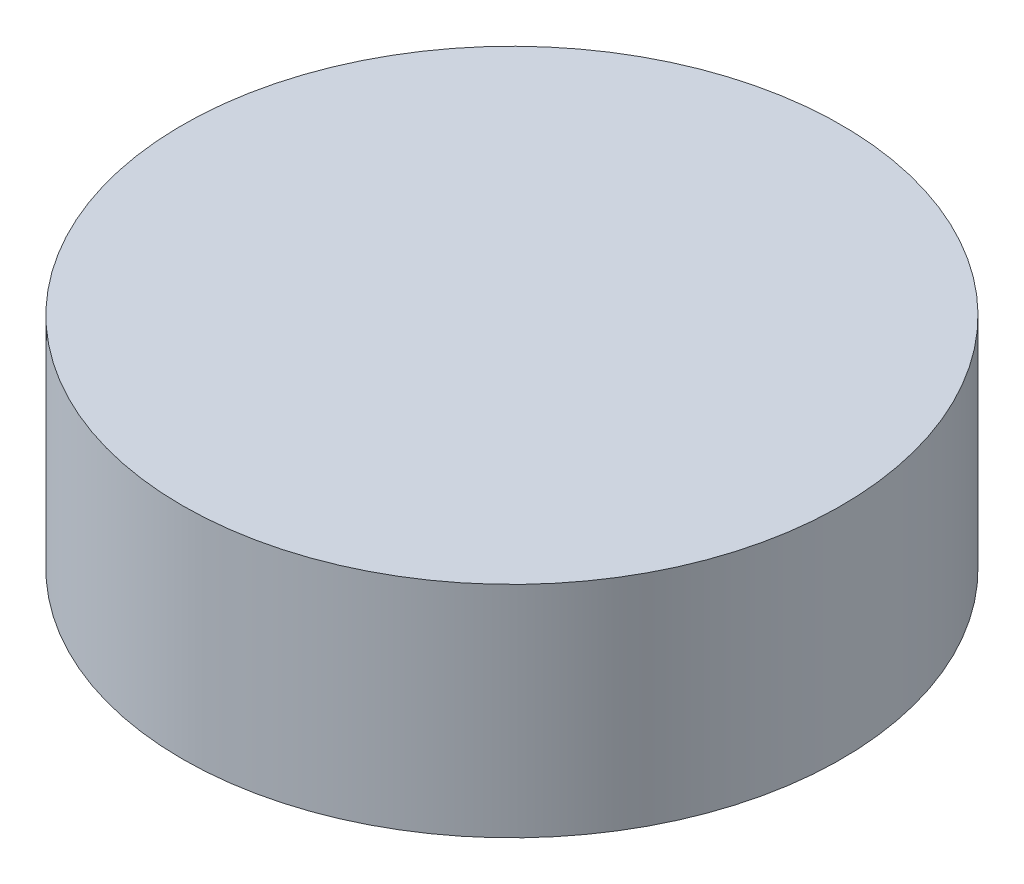
ISO-10303-21;
HEADER;
FILE_DESCRIPTION(('STEP AP214'),'2;1');
FILE_NAME('part.step','',(''),(''),'','','');
FILE_SCHEMA(('AUTOMOTIVE_DESIGN { 1 0 10303 214 1 1 1 1 }'));
ENDSEC;
DATA;
#1=APPLICATION_CONTEXT('core data for automotive mechanical design processes');
#2=APPLICATION_PROTOCOL_DEFINITION('international standard','automotive_design',2000,#1);
#3=PRODUCT_CONTEXT('',#1,'mechanical');
#4=PRODUCT('Part','Part','',(#3));
#5=PRODUCT_RELATED_PRODUCT_CATEGORY('part','',(#4));
#6=PRODUCT_DEFINITION_FORMATION('','',#4);
#7=PRODUCT_DEFINITION_CONTEXT('part definition',#1,'design');
#8=PRODUCT_DEFINITION('design','',#6,#7);
#9=PRODUCT_DEFINITION_SHAPE('','',#8);
#10=(LENGTH_UNIT() NAMED_UNIT(*) SI_UNIT(.MILLI.,.METRE.));
#11=(NAMED_UNIT(*) PLANE_ANGLE_UNIT() SI_UNIT($,.RADIAN.));
#12=(NAMED_UNIT(*) SI_UNIT($,.STERADIAN.) SOLID_ANGLE_UNIT());
#13=UNCERTAINTY_MEASURE_WITH_UNIT(LENGTH_MEASURE(1.E-05),#10,'distance_accuracy_value','');
#14=(GEOMETRIC_REPRESENTATION_CONTEXT(3) GLOBAL_UNCERTAINTY_ASSIGNED_CONTEXT((#13)) GLOBAL_UNIT_ASSIGNED_CONTEXT((#10,
#11,#12)) REPRESENTATION_CONTEXT('',''));
#15=CARTESIAN_POINT('',(0.,0.,0.));
#16=DIRECTION('',(0.,0.,1.));
#17=DIRECTION('',(1.,0.,0.));
#18=AXIS2_PLACEMENT_3D('',#15,#16,#17);
#19=CARTESIAN_POINT('',(0.,3.33,0.));
#20=DIRECTION('',(0.,-1.,0.));
#21=DIRECTION('',(0.,0.,-1.));
#22=AXIS2_PLACEMENT_3D('',#19,#20,#21);
#23=CYLINDRICAL_SURFACE('',#22,5.);
#24=CARTESIAN_POINT('',(0.,3.33,0.));
#25=DIRECTION('',(0.,1.,0.));
#26=DIRECTION('',(0.,0.,1.));
#27=AXIS2_PLACEMENT_3D('',#24,#25,#26);
#28=CIRCLE('',#27,5.);
#29=CARTESIAN_POINT('',(0.,3.33,5.));
#30=VERTEX_POINT('',#29);
#31=EDGE_CURVE('E10',#30,#30,#28,.T.);
#32=ORIENTED_EDGE('',*,*,#31,.F.);
#33=EDGE_LOOP('',(#32));
#34=FACE_BOUND('',#33,.T.);
#35=CARTESIAN_POINT('',(0.,0.,0.));
#36=DIRECTION('',(0.,1.,0.));
#37=DIRECTION('',(0.,0.,1.));
#38=AXIS2_PLACEMENT_3D('',#35,#36,#37);
#39=CIRCLE('',#38,5.);
#40=CARTESIAN_POINT('',(0.,0.,5.));
#41=VERTEX_POINT('',#40);
#42=EDGE_CURVE('E44',#41,#41,#39,.T.);
#43=ORIENTED_EDGE('',*,*,#42,.T.);
#44=EDGE_LOOP('',(#43));
#45=FACE_BOUND('',#44,.T.);
#46=ADVANCED_FACE('F41',(#34,#45),#23,.T.);
#47=CARTESIAN_POINT('',(0.,3.33,0.));
#48=DIRECTION('',(0.,1.,0.));
#49=DIRECTION('',(0.,0.,1.));
#50=AXIS2_PLACEMENT_3D('',#47,#48,#49);
#51=PLANE('',#50);
#52=ORIENTED_EDGE('',*,*,#31,.T.);
#53=EDGE_LOOP('',(#52));
#54=FACE_BOUND('',#53,.T.);
#55=ADVANCED_FACE('F70',(#54),#51,.T.);
#56=CARTESIAN_POINT('',(0.,0.,0.));
#57=DIRECTION('',(0.,1.,0.));
#58=DIRECTION('',(0.,0.,1.));
#59=AXIS2_PLACEMENT_3D('',#56,#57,#58);
#60=PLANE('',#59);
#61=CARTESIAN_POINT('',(0.,0.,0.));
#62=DIRECTION('',(0.,-1.,0.));
#63=DIRECTION('',(0.,0.,-1.));
#64=AXIS2_PLACEMENT_3D('',#61,#62,#63);
#65=CIRCLE('',#64,3.5);
#66=CARTESIAN_POINT('',(0.,0.,-3.5));
#67=VERTEX_POINT('',#66);
#68=EDGE_CURVE('E53',#67,#67,#65,.T.);
#69=ORIENTED_EDGE('',*,*,#68,.F.);
#70=EDGE_LOOP('',(#69));
#71=FACE_BOUND('',#70,.T.);
#72=ORIENTED_EDGE('',*,*,#42,.F.);
#73=EDGE_LOOP('',(#72));
#74=FACE_BOUND('',#73,.T.);
#75=ADVANCED_FACE('F64',(#71,#74),#60,.F.);
#76=CARTESIAN_POINT('',(0.,2.,0.));
#77=DIRECTION('',(0.,-1.,0.));
#78=DIRECTION('',(0.,0.,-1.));
#79=AXIS2_PLACEMENT_3D('',#76,#77,#78);
#80=CYLINDRICAL_SURFACE('',#79,3.5);
#81=CARTESIAN_POINT('',(0.,2.,0.));
#82=DIRECTION('',(0.,-1.,0.));
#83=DIRECTION('',(0.,0.,-1.));
#84=AXIS2_PLACEMENT_3D('',#81,#82,#83);
#85=CIRCLE('',#84,3.5);
#86=CARTESIAN_POINT('',(0.,2.,-3.5));
#87=VERTEX_POINT('',#86);
#88=EDGE_CURVE('E51',#87,#87,#85,.T.);
#89=ORIENTED_EDGE('',*,*,#88,.F.);
#90=EDGE_LOOP('',(#89));
#91=FACE_BOUND('',#90,.T.);
#92=ORIENTED_EDGE('',*,*,#68,.T.);
#93=EDGE_LOOP('',(#92));
#94=FACE_BOUND('',#93,.T.);
#95=ADVANCED_FACE('F61',(#91,#94),#80,.F.);
#96=CARTESIAN_POINT('',(0.,2.,0.));
#97=DIRECTION('',(0.,-1.,0.));
#98=DIRECTION('',(0.,0.,-1.));
#99=AXIS2_PLACEMENT_3D('',#96,#97,#98);
#100=PLANE('',#99);
#101=ORIENTED_EDGE('',*,*,#88,.T.);
#102=EDGE_LOOP('',(#101));
#103=FACE_BOUND('',#102,.T.);
#104=ADVANCED_FACE('F59',(#103),#100,.T.);
#105=CLOSED_SHELL('',(#46,#55,#75,#95,#104));
#106=MANIFOLD_SOLID_BREP('B2',#105);
#107=ADVANCED_BREP_SHAPE_REPRESENTATION('',(#18,#106),#14);
#108=SHAPE_DEFINITION_REPRESENTATION(#9,#107);
ENDSEC;
END-ISO-10303-21;
